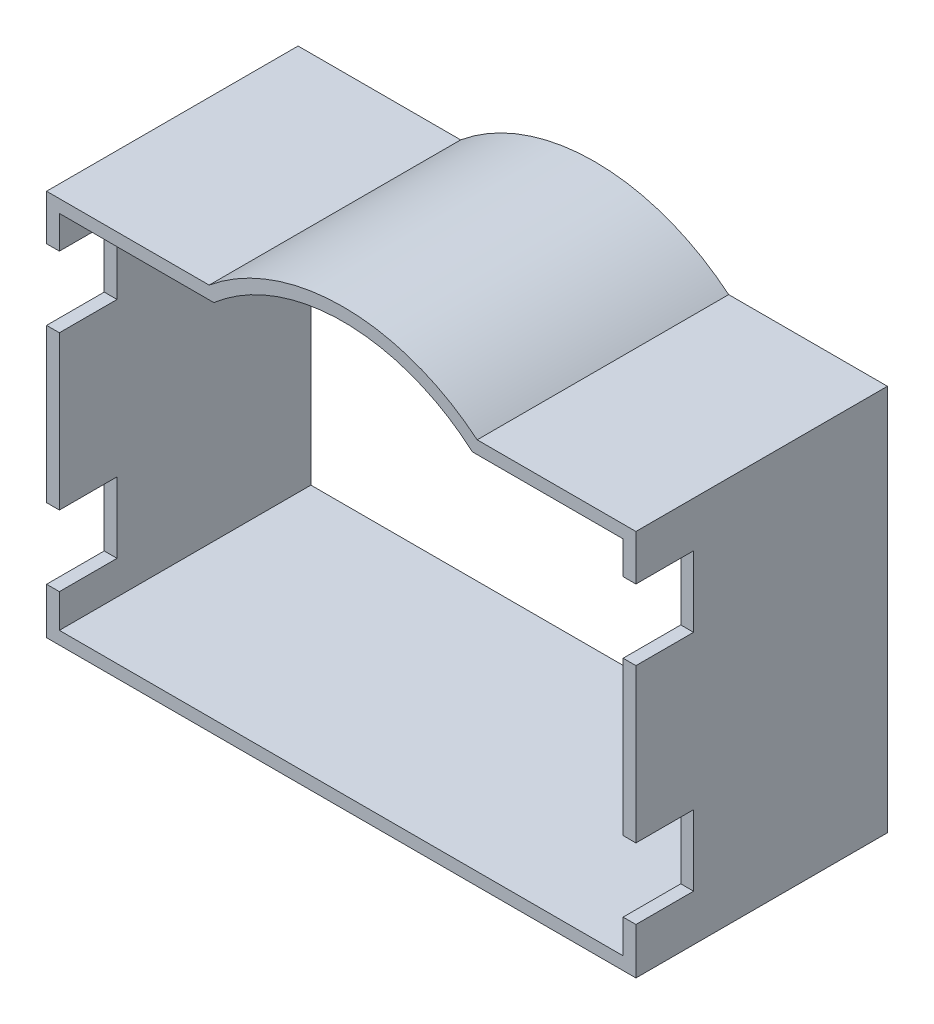
ISO-10303-21;
HEADER;
FILE_DESCRIPTION(('STEP AP214'),'2;1');
FILE_NAME('part.step','',(''),(''),'','','');
FILE_SCHEMA(('AUTOMOTIVE_DESIGN { 1 0 10303 214 1 1 1 1 }'));
ENDSEC;
DATA;
#1=APPLICATION_CONTEXT('core data for automotive mechanical design processes');
#2=APPLICATION_PROTOCOL_DEFINITION('international standard','automotive_design',2000,#1);
#3=PRODUCT_CONTEXT('',#1,'mechanical');
#4=PRODUCT('Part','Part','',(#3));
#5=PRODUCT_RELATED_PRODUCT_CATEGORY('part','',(#4));
#6=PRODUCT_DEFINITION_FORMATION('','',#4);
#7=PRODUCT_DEFINITION_CONTEXT('part definition',#1,'design');
#8=PRODUCT_DEFINITION('design','',#6,#7);
#9=PRODUCT_DEFINITION_SHAPE('','',#8);
#10=(LENGTH_UNIT() NAMED_UNIT(*) SI_UNIT(.MILLI.,.METRE.));
#11=(NAMED_UNIT(*) PLANE_ANGLE_UNIT() SI_UNIT($,.RADIAN.));
#12=(NAMED_UNIT(*) SI_UNIT($,.STERADIAN.) SOLID_ANGLE_UNIT());
#13=UNCERTAINTY_MEASURE_WITH_UNIT(LENGTH_MEASURE(1.E-05),#10,'distance_accuracy_value','');
#14=(GEOMETRIC_REPRESENTATION_CONTEXT(3) GLOBAL_UNCERTAINTY_ASSIGNED_CONTEXT((#13)) GLOBAL_UNIT_ASSIGNED_CONTEXT((#10,
#11,#12)) REPRESENTATION_CONTEXT('',''));
#15=CARTESIAN_POINT('',(0.,0.,0.));
#16=DIRECTION('',(0.,0.,1.));
#17=DIRECTION('',(1.,0.,0.));
#18=AXIS2_PLACEMENT_3D('',#15,#16,#17);
#19=CARTESIAN_POINT('',(-5.12505883331051,40.0050902585687,49.8602));
#20=DIRECTION('',(0.,0.,-1.));
#21=DIRECTION('',(-1.,0.,0.));
#22=AXIS2_PLACEMENT_3D('',#19,#20,#21);
#23=PLANE('',#22);
#24=DIRECTION('',(0.,-1.,0.));
#25=VECTOR('',#24,1.);
#26=CARTESIAN_POINT('',(-63.9235600904745,40.0050902585687,49.8602));
#27=LINE('',#26,#25);
#28=CARTESIAN_POINT('',(-63.9235600904745,49.1149246648017,49.8602));
#29=VERTEX_POINT('',#28);
#30=CARTESIAN_POINT('',(-63.9235600904744,18.6689837729242,49.8602));
#31=VERTEX_POINT('',#30);
#32=EDGE_CURVE('E482',#29,#31,#27,.T.);
#33=ORIENTED_EDGE('',*,*,#32,.T.);
#34=DIRECTION('',(-1.,0.,0.));
#35=VECTOR('',#34,1.);
#36=CARTESIAN_POINT('',(-63.9235600904744,18.6689837729242,49.8602));
#37=LINE('',#36,#35);
#38=CARTESIAN_POINT('',(-61.3835600904745,18.6689837729242,49.8602));
#39=VERTEX_POINT('',#38);
#40=EDGE_CURVE('E268',#39,#31,#37,.T.);
#41=ORIENTED_EDGE('',*,*,#40,.F.);
#42=DIRECTION('',(0.,-1.,0.));
#43=VECTOR('',#42,1.);
#44=CARTESIAN_POINT('',(-61.3835600904745,-1.97724052467224,49.8602));
#45=LINE('',#44,#43);
#46=CARTESIAN_POINT('',(-61.3835600904745,49.1149246648017,49.8602));
#47=VERTEX_POINT('',#46);
#48=EDGE_CURVE('E377',#47,#39,#45,.T.);
#49=ORIENTED_EDGE('',*,*,#48,.F.);
#50=DIRECTION('',(1.,0.,0.));
#51=VECTOR('',#50,1.);
#52=CARTESIAN_POINT('',(-63.9235600904745,49.1149246648017,49.8602));
#53=LINE('',#52,#51);
#54=EDGE_CURVE('E289',#29,#47,#53,.T.);
#55=ORIENTED_EDGE('',*,*,#54,.F.);
#56=EDGE_LOOP('',(#33,#41,#49,#55));
#57=FACE_BOUND('',#56,.T.);
#58=ADVANCED_FACE('F39',(#57),#23,.F.);
#59=DIRECTION('',(0.,1.,0.));
#60=VECTOR('',#59,1.);
#61=CARTESIAN_POINT('',(52.9114432215255,40.0050902585687,49.8602));
#62=LINE('',#61,#60);
#63=CARTESIAN_POINT('',(52.9114432215256,18.6689837729242,49.8602));
#64=VERTEX_POINT('',#63);
#65=CARTESIAN_POINT('',(52.9114432215256,49.1149246648017,49.8602));
#66=VERTEX_POINT('',#65);
#67=EDGE_CURVE('E255',#64,#66,#62,.T.);
#68=ORIENTED_EDGE('',*,*,#67,.T.);
#69=DIRECTION('',(1.,0.,0.));
#70=VECTOR('',#69,1.);
#71=CARTESIAN_POINT('',(52.9114432215256,49.1149246648017,49.8602));
#72=LINE('',#71,#70);
#73=CARTESIAN_POINT('',(50.3714432215255,49.1149246648017,49.8602));
#74=VERTEX_POINT('',#73);
#75=EDGE_CURVE('E304',#74,#66,#72,.T.);
#76=ORIENTED_EDGE('',*,*,#75,.F.);
#77=DIRECTION('',(0.,1.,0.));
#78=VECTOR('',#77,1.);
#79=CARTESIAN_POINT('',(50.3714432215255,-1.97724052467224,49.8602));
#80=LINE('',#79,#78);
#81=CARTESIAN_POINT('',(50.3714432215255,18.6689837729242,49.8602));
#82=VERTEX_POINT('',#81);
#83=EDGE_CURVE('E386',#82,#74,#80,.T.);
#84=ORIENTED_EDGE('',*,*,#83,.F.);
#85=DIRECTION('',(-1.,0.,0.));
#86=VECTOR('',#85,1.);
#87=CARTESIAN_POINT('',(52.9114432215256,18.6689837729242,49.8602));
#88=LINE('',#87,#86);
#89=EDGE_CURVE('E564',#64,#82,#88,.T.);
#90=ORIENTED_EDGE('',*,*,#89,.F.);
#91=EDGE_LOOP('',(#68,#76,#84,#90));
#92=FACE_BOUND('',#91,.T.);
#93=ADVANCED_FACE('F563',(#92),#23,.F.);
#94=CARTESIAN_POINT('',(-61.3835600904745,4.66896129128226,49.8602));
#95=VERTEX_POINT('',#94);
#96=CARTESIAN_POINT('',(-61.3835600904745,-1.97724052467224,49.8602));
#97=VERTEX_POINT('',#96);
#98=EDGE_CURVE('E371',#95,#97,#45,.T.);
#99=ORIENTED_EDGE('',*,*,#98,.F.);
#100=DIRECTION('',(1.,0.,0.));
#101=VECTOR('',#100,1.);
#102=CARTESIAN_POINT('',(-63.9235600904744,4.66896129128226,49.8602));
#103=LINE('',#102,#101);
#104=CARTESIAN_POINT('',(-63.9235600904744,4.66896129128226,49.8602));
#105=VERTEX_POINT('',#104);
#106=EDGE_CURVE('E279',#105,#95,#103,.T.);
#107=ORIENTED_EDGE('',*,*,#106,.F.);
#108=CARTESIAN_POINT('',(-63.9235600904745,-4.51724052467224,49.8602));
#109=VERTEX_POINT('',#108);
#110=EDGE_CURVE('E476',#105,#109,#27,.T.);
#111=ORIENTED_EDGE('',*,*,#110,.T.);
#112=DIRECTION('',(1.,0.,0.));
#113=VECTOR('',#112,1.);
#114=CARTESIAN_POINT('',(-5.12505883331051,-4.51724052467224,49.8602));
#115=LINE('',#114,#113);
#116=CARTESIAN_POINT('',(52.9114432215255,-4.51724052467224,49.8602));
#117=VERTEX_POINT('',#116);
#118=EDGE_CURVE('E481',#109,#117,#115,.T.);
#119=ORIENTED_EDGE('',*,*,#118,.T.);
#120=CARTESIAN_POINT('',(52.9114432215256,4.66896129128226,49.8602));
#121=VERTEX_POINT('',#120);
#122=EDGE_CURVE('E485',#117,#121,#62,.T.);
#123=ORIENTED_EDGE('',*,*,#122,.T.);
#124=DIRECTION('',(1.,0.,0.));
#125=VECTOR('',#124,1.);
#126=CARTESIAN_POINT('',(52.9114432215256,4.66896129128226,49.8602));
#127=LINE('',#126,#125);
#128=CARTESIAN_POINT('',(50.3714432215255,4.66896129128226,49.8602));
#129=VERTEX_POINT('',#128);
#130=EDGE_CURVE('E248',#129,#121,#127,.T.);
#131=ORIENTED_EDGE('',*,*,#130,.F.);
#132=CARTESIAN_POINT('',(50.3714432215255,-1.97724052467224,49.8602));
#133=VERTEX_POINT('',#132);
#134=EDGE_CURVE('E381',#133,#129,#80,.T.);
#135=ORIENTED_EDGE('',*,*,#134,.F.);
#136=DIRECTION('',(1.,0.,0.));
#137=VECTOR('',#136,1.);
#138=CARTESIAN_POINT('',(-61.3835600904745,-1.97724052467224,49.8602));
#139=LINE('',#138,#137);
#140=EDGE_CURVE('E376',#97,#133,#139,.T.);
#141=ORIENTED_EDGE('',*,*,#140,.F.);
#142=EDGE_LOOP('',(#99,#107,#111,#119,#123,#131,#135,#141));
#143=FACE_BOUND('',#142,.T.);
#144=ADVANCED_FACE('F588',(#143),#23,.F.);
#145=CARTESIAN_POINT('',(50.3714432215255,63.1189826998972,49.8602));
#146=VERTEX_POINT('',#145);
#147=CARTESIAN_POINT('',(50.3714432215255,69.6059637898241,49.8602));
#148=VERTEX_POINT('',#147);
#149=EDGE_CURVE('E380',#146,#148,#80,.T.);
#150=ORIENTED_EDGE('',*,*,#149,.F.);
#151=DIRECTION('',(-1.,0.,0.));
#152=VECTOR('',#151,1.);
#153=CARTESIAN_POINT('',(52.9114432215256,63.1189826998972,49.8602));
#154=LINE('',#153,#152);
#155=CARTESIAN_POINT('',(52.9114432215256,63.1189826998972,49.8602));
#156=VERTEX_POINT('',#155);
#157=EDGE_CURVE('E315',#156,#146,#154,.T.);
#158=ORIENTED_EDGE('',*,*,#157,.F.);
#159=CARTESIAN_POINT('',(52.9114432215255,72.1459637898241,49.8602));
#160=VERTEX_POINT('',#159);
#161=EDGE_CURVE('E484',#156,#160,#62,.T.);
#162=ORIENTED_EDGE('',*,*,#161,.T.);
#163=DIRECTION('',(-1.,0.,0.));
#164=VECTOR('',#163,1.);
#165=CARTESIAN_POINT('',(-5.12505883331051,72.1459637898241,49.8602));
#166=LINE('',#165,#164);
#167=CARTESIAN_POINT('',(21.4410870415425,72.1459637898241,49.8602));
#168=VERTEX_POINT('',#167);
#169=EDGE_CURVE('E43',#160,#168,#166,.T.);
#170=ORIENTED_EDGE('',*,*,#169,.T.);
#171=CARTESIAN_POINT('',(-5.12505883331051,40.0050902585687,49.8602));
#172=DIRECTION('',(0.,0.,-1.));
#173=DIRECTION('',(-1.,0.,0.));
#174=AXIS2_PLACEMENT_3D('',#171,#172,#173);
#175=CIRCLE('',#174,41.6988711837157);
#176=CARTESIAN_POINT('',(-31.6912047081635,72.1459637898241,49.8602));
#177=VERTEX_POINT('',#176);
#178=EDGE_CURVE('E458',#168,#177,#175,.F.);
#179=ORIENTED_EDGE('',*,*,#178,.T.);
#180=DIRECTION('',(-1.,0.,0.));
#181=VECTOR('',#180,1.);
#182=CARTESIAN_POINT('',(-5.12505883331051,72.1459637898241,49.8602));
#183=LINE('',#182,#181);
#184=CARTESIAN_POINT('',(-63.9235600904745,72.1459637898241,49.8602));
#185=VERTEX_POINT('',#184);
#186=EDGE_CURVE('E473',#177,#185,#183,.T.);
#187=ORIENTED_EDGE('',*,*,#186,.T.);
#188=CARTESIAN_POINT('',(-63.9235600904745,63.1189622718156,49.8602));
#189=VERTEX_POINT('',#188);
#190=EDGE_CURVE('E477',#185,#189,#27,.T.);
#191=ORIENTED_EDGE('',*,*,#190,.T.);
#192=DIRECTION('',(-1.,0.,0.));
#193=VECTOR('',#192,1.);
#194=CARTESIAN_POINT('',(-63.9235600904745,63.1189622718156,49.8602));
#195=LINE('',#194,#193);
#196=CARTESIAN_POINT('',(-61.3835600904745,63.1189622718156,49.8602));
#197=VERTEX_POINT('',#196);
#198=EDGE_CURVE('E335',#197,#189,#195,.T.);
#199=ORIENTED_EDGE('',*,*,#198,.F.);
#200=CARTESIAN_POINT('',(-61.3835600904745,69.6059637898241,49.8602));
#201=VERTEX_POINT('',#200);
#202=EDGE_CURVE('E372',#201,#197,#45,.T.);
#203=ORIENTED_EDGE('',*,*,#202,.F.);
#204=DIRECTION('',(-1.,0.,0.));
#205=VECTOR('',#204,1.);
#206=CARTESIAN_POINT('',(-61.3835600904745,69.6059637898241,49.8602));
#207=LINE('',#206,#205);
#208=CARTESIAN_POINT('',(-30.761077997164,69.6059637898241,49.8602));
#209=VERTEX_POINT('',#208);
#210=EDGE_CURVE('E367',#209,#201,#207,.T.);
#211=ORIENTED_EDGE('',*,*,#210,.F.);
#212=CARTESIAN_POINT('',(-5.12505883331051,40.0050902585687,49.8602));
#213=DIRECTION('',(0.,0.,1.));
#214=DIRECTION('',(-1.,0.,0.));
#215=AXIS2_PLACEMENT_3D('',#212,#213,#214);
#216=CIRCLE('',#215,39.1588711837157);
#217=CARTESIAN_POINT('',(20.510960330543,69.6059637898241,49.8602));
#218=VERTEX_POINT('',#217);
#219=EDGE_CURVE('E364',#218,#209,#216,.T.);
#220=ORIENTED_EDGE('',*,*,#219,.F.);
#221=DIRECTION('',(-1.,0.,0.));
#222=VECTOR('',#221,1.);
#223=CARTESIAN_POINT('',(20.510960330543,69.6059637898241,49.8602));
#224=LINE('',#223,#222);
#225=EDGE_CURVE('E385',#148,#218,#224,.T.);
#226=ORIENTED_EDGE('',*,*,#225,.F.);
#227=EDGE_LOOP('',(#150,#158,#162,#170,#179,#187,#191,#199,#203,#211,#220,#226));
#228=FACE_BOUND('',#227,.T.);
#229=ADVANCED_FACE('F499',(#228),#23,.F.);
#230=CARTESIAN_POINT('',(-5.12505883331051,40.0050902585687,0.));
#231=DIRECTION('',(0.,0.,-1.));
#232=DIRECTION('',(-1.,0.,0.));
#233=AXIS2_PLACEMENT_3D('',#230,#231,#232);
#234=PLANE('',#233);
#235=CARTESIAN_POINT('',(-5.12505883331051,40.0050902585687,0.));
#236=DIRECTION('',(0.,0.,-1.));
#237=DIRECTION('',(-1.,0.,0.));
#238=AXIS2_PLACEMENT_3D('',#235,#236,#237);
#239=CIRCLE('',#238,41.6988711837157);
#240=CARTESIAN_POINT('',(21.4410870415425,72.1459637898241,0.));
#241=VERTEX_POINT('',#240);
#242=CARTESIAN_POINT('',(-31.6912047081635,72.1459637898241,0.));
#243=VERTEX_POINT('',#242);
#244=EDGE_CURVE('E430',#241,#243,#239,.F.);
#245=ORIENTED_EDGE('',*,*,#244,.F.);
#246=DIRECTION('',(-1.,0.,0.));
#247=VECTOR('',#246,1.);
#248=CARTESIAN_POINT('',(-5.12505883331051,72.1459637898241,0.));
#249=LINE('',#248,#247);
#250=CARTESIAN_POINT('',(52.9114432215255,72.1459637898241,0.));
#251=VERTEX_POINT('',#250);
#252=EDGE_CURVE('E455',#251,#241,#249,.T.);
#253=ORIENTED_EDGE('',*,*,#252,.F.);
#254=DIRECTION('',(0.,1.,0.));
#255=VECTOR('',#254,1.);
#256=CARTESIAN_POINT('',(52.9114432215255,40.0050902585687,0.));
#257=LINE('',#256,#255);
#258=CARTESIAN_POINT('',(52.9114432215255,-4.51724052467224,0.));
#259=VERTEX_POINT('',#258);
#260=EDGE_CURVE('E459',#259,#251,#257,.T.);
#261=ORIENTED_EDGE('',*,*,#260,.F.);
#262=DIRECTION('',(1.,0.,0.));
#263=VECTOR('',#262,1.);
#264=CARTESIAN_POINT('',(-5.12505883331051,-4.51724052467224,0.));
#265=LINE('',#264,#263);
#266=CARTESIAN_POINT('',(-63.9235600904745,-4.51724052467224,0.));
#267=VERTEX_POINT('',#266);
#268=EDGE_CURVE('E462',#267,#259,#265,.T.);
#269=ORIENTED_EDGE('',*,*,#268,.F.);
#270=DIRECTION('',(0.,-1.,0.));
#271=VECTOR('',#270,1.);
#272=CARTESIAN_POINT('',(-63.9235600904745,40.0050902585687,0.));
#273=LINE('',#272,#271);
#274=CARTESIAN_POINT('',(-63.9235600904745,72.1459637898241,0.));
#275=VERTEX_POINT('',#274);
#276=EDGE_CURVE('E465',#275,#267,#273,.T.);
#277=ORIENTED_EDGE('',*,*,#276,.F.);
#278=DIRECTION('',(-1.,0.,0.));
#279=VECTOR('',#278,1.);
#280=CARTESIAN_POINT('',(-5.12505883331051,72.1459637898241,0.));
#281=LINE('',#280,#279);
#282=EDGE_CURVE('E454',#243,#275,#281,.T.);
#283=ORIENTED_EDGE('',*,*,#282,.F.);
#284=EDGE_LOOP('',(#245,#253,#261,#269,#277,#283));
#285=FACE_BOUND('',#284,.T.);
#286=DIRECTION('',(-1.,0.,0.));
#287=VECTOR('',#286,1.);
#288=CARTESIAN_POINT('',(20.510960330543,69.6059637898241,0.));
#289=LINE('',#288,#287);
#290=CARTESIAN_POINT('',(50.3714432215255,69.6059637898241,0.));
#291=VERTEX_POINT('',#290);
#292=CARTESIAN_POINT('',(20.510960330543,69.6059637898241,0.));
#293=VERTEX_POINT('',#292);
#294=EDGE_CURVE('E368',#291,#293,#289,.T.);
#295=ORIENTED_EDGE('',*,*,#294,.T.);
#296=CARTESIAN_POINT('',(-5.12505883331051,40.0050902585687,0.));
#297=DIRECTION('',(0.,0.,1.));
#298=DIRECTION('',(-1.,0.,0.));
#299=AXIS2_PLACEMENT_3D('',#296,#297,#298);
#300=CIRCLE('',#299,39.1588711837157);
#301=CARTESIAN_POINT('',(-30.761077997164,69.6059637898241,0.));
#302=VERTEX_POINT('',#301);
#303=EDGE_CURVE('E354',#293,#302,#300,.T.);
#304=ORIENTED_EDGE('',*,*,#303,.T.);
#305=DIRECTION('',(-1.,0.,0.));
#306=VECTOR('',#305,1.);
#307=CARTESIAN_POINT('',(-61.3835600904745,69.6059637898241,0.));
#308=LINE('',#307,#306);
#309=CARTESIAN_POINT('',(-61.3835600904745,69.6059637898241,0.));
#310=VERTEX_POINT('',#309);
#311=EDGE_CURVE('E393',#302,#310,#308,.T.);
#312=ORIENTED_EDGE('',*,*,#311,.T.);
#313=DIRECTION('',(0.,-1.,0.));
#314=VECTOR('',#313,1.);
#315=CARTESIAN_POINT('',(-61.3835600904745,-1.97724052467224,0.));
#316=LINE('',#315,#314);
#317=CARTESIAN_POINT('',(-61.3835600904745,-1.97724052467224,0.));
#318=VERTEX_POINT('',#317);
#319=EDGE_CURVE('E397',#310,#318,#316,.T.);
#320=ORIENTED_EDGE('',*,*,#319,.T.);
#321=DIRECTION('',(1.,0.,0.));
#322=VECTOR('',#321,1.);
#323=CARTESIAN_POINT('',(-61.3835600904745,-1.97724052467224,0.));
#324=LINE('',#323,#322);
#325=CARTESIAN_POINT('',(50.3714432215255,-1.97724052467224,0.));
#326=VERTEX_POINT('',#325);
#327=EDGE_CURVE('E401',#318,#326,#324,.T.);
#328=ORIENTED_EDGE('',*,*,#327,.T.);
#329=DIRECTION('',(0.,1.,0.));
#330=VECTOR('',#329,1.);
#331=CARTESIAN_POINT('',(50.3714432215255,-1.97724052467224,0.));
#332=LINE('',#331,#330);
#333=EDGE_CURVE('E405',#326,#291,#332,.T.);
#334=ORIENTED_EDGE('',*,*,#333,.T.);
#335=EDGE_LOOP('',(#295,#304,#312,#320,#328,#334));
#336=FACE_BOUND('',#335,.T.);
#337=ADVANCED_FACE('F544',(#285,#336),#234,.T.);
#338=CARTESIAN_POINT('',(-5.12505883331051,40.0050902585687,49.8602));
#339=DIRECTION('',(0.,0.,-1.));
#340=DIRECTION('',(-1.,0.,0.));
#341=AXIS2_PLACEMENT_3D('',#338,#339,#340);
#342=CYLINDRICAL_SURFACE('',#341,41.6988711837157);
#343=ORIENTED_EDGE('',*,*,#244,.T.);
#344=DIRECTION('',(0.,0.,-1.));
#345=VECTOR('',#344,1.);
#346=CARTESIAN_POINT('',(-31.6912047081635,72.1459637898241,49.8602));
#347=LINE('',#346,#345);
#348=EDGE_CURVE('E11',#177,#243,#347,.T.);
#349=ORIENTED_EDGE('',*,*,#348,.F.);
#350=ORIENTED_EDGE('',*,*,#178,.F.);
#351=DIRECTION('',(0.,0.,-1.));
#352=VECTOR('',#351,1.);
#353=CARTESIAN_POINT('',(21.4410870415425,72.1459637898241,49.8602));
#354=LINE('',#353,#352);
#355=EDGE_CURVE('E432',#168,#241,#354,.T.);
#356=ORIENTED_EDGE('',*,*,#355,.T.);
#357=EDGE_LOOP('',(#343,#349,#350,#356));
#358=FACE_BOUND('',#357,.T.);
#359=ADVANCED_FACE('F510',(#358),#342,.T.);
#360=CARTESIAN_POINT('',(-61.3835600904745,72.1459637898241,49.8602));
#361=DIRECTION('',(0.,-1.,0.));
#362=DIRECTION('',(0.,0.,-1.));
#363=AXIS2_PLACEMENT_3D('',#360,#361,#362);
#364=PLANE('',#363);
#365=ORIENTED_EDGE('',*,*,#282,.T.);
#366=DIRECTION('',(0.,0.,-1.));
#367=VECTOR('',#366,1.);
#368=CARTESIAN_POINT('',(-63.9235600904745,72.1459637898241,49.8602));
#369=LINE('',#368,#367);
#370=EDGE_CURVE('E49',#185,#275,#369,.T.);
#371=ORIENTED_EDGE('',*,*,#370,.F.);
#372=ORIENTED_EDGE('',*,*,#186,.F.);
#373=ORIENTED_EDGE('',*,*,#348,.T.);
#374=EDGE_LOOP('',(#365,#371,#372,#373));
#375=FACE_BOUND('',#374,.T.);
#376=ADVANCED_FACE('F515',(#375),#364,.F.);
#377=CARTESIAN_POINT('',(-63.9235600904745,-1.97724052467224,49.8602));
#378=DIRECTION('',(1.,0.,0.));
#379=DIRECTION('',(0.,0.,-1.));
#380=AXIS2_PLACEMENT_3D('',#377,#378,#379);
#381=PLANE('',#380);
#382=DIRECTION('',(0.,-1.,0.));
#383=VECTOR('',#382,1.);
#384=CARTESIAN_POINT('',(-63.9235600904744,18.6689837729242,38.4302));
#385=LINE('',#384,#383);
#386=CARTESIAN_POINT('',(-63.9235600904744,18.6689837729242,38.4302));
#387=VERTEX_POINT('',#386);
#388=CARTESIAN_POINT('',(-63.9235600904744,4.66896129128226,38.4302));
#389=VERTEX_POINT('',#388);
#390=EDGE_CURVE('E265',#387,#389,#385,.T.);
#391=ORIENTED_EDGE('',*,*,#390,.F.);
#392=DIRECTION('',(0.,0.,1.));
#393=VECTOR('',#392,1.);
#394=CARTESIAN_POINT('',(-63.9235600904744,18.6689837729242,38.4302));
#395=LINE('',#394,#393);
#396=EDGE_CURVE('E285',#387,#31,#395,.T.);
#397=ORIENTED_EDGE('',*,*,#396,.T.);
#398=ORIENTED_EDGE('',*,*,#32,.F.);
#399=DIRECTION('',(0.,0.,1.));
#400=VECTOR('',#399,1.);
#401=CARTESIAN_POINT('',(-63.9235600904745,49.1149246648017,38.4302));
#402=LINE('',#401,#400);
#403=CARTESIAN_POINT('',(-63.9235600904745,49.1149246648017,38.4302));
#404=VERTEX_POINT('',#403);
#405=EDGE_CURVE('E345',#404,#29,#402,.T.);
#406=ORIENTED_EDGE('',*,*,#405,.F.);
#407=DIRECTION('',(0.,-1.,0.));
#408=VECTOR('',#407,1.);
#409=CARTESIAN_POINT('',(-63.9235600904745,63.1189622718156,38.4302));
#410=LINE('',#409,#408);
#411=CARTESIAN_POINT('',(-63.9235600904745,63.1189622718156,38.4302));
#412=VERTEX_POINT('',#411);
#413=EDGE_CURVE('E332',#412,#404,#410,.T.);
#414=ORIENTED_EDGE('',*,*,#413,.F.);
#415=DIRECTION('',(0.,0.,1.));
#416=VECTOR('',#415,1.);
#417=CARTESIAN_POINT('',(-63.9235600904745,63.1189622718156,38.4302));
#418=LINE('',#417,#416);
#419=EDGE_CURVE('E350',#412,#189,#418,.T.);
#420=ORIENTED_EDGE('',*,*,#419,.T.);
#421=ORIENTED_EDGE('',*,*,#190,.F.);
#422=ORIENTED_EDGE('',*,*,#370,.T.);
#423=ORIENTED_EDGE('',*,*,#276,.T.);
#424=DIRECTION('',(0.,0.,-1.));
#425=VECTOR('',#424,1.);
#426=CARTESIAN_POINT('',(-63.9235600904745,-4.51724052467224,49.8602));
#427=LINE('',#426,#425);
#428=EDGE_CURVE('E440',#109,#267,#427,.T.);
#429=ORIENTED_EDGE('',*,*,#428,.F.);
#430=ORIENTED_EDGE('',*,*,#110,.F.);
#431=DIRECTION('',(0.,0.,1.));
#432=VECTOR('',#431,1.);
#433=CARTESIAN_POINT('',(-63.9235600904744,4.66896129128226,38.4302));
#434=LINE('',#433,#432);
#435=EDGE_CURVE('E278',#389,#105,#434,.T.);
#436=ORIENTED_EDGE('',*,*,#435,.F.);
#437=EDGE_LOOP('',(#391,#397,#398,#406,#414,#420,#421,#422,#423,#429,#430,#436));
#438=FACE_BOUND('',#437,.T.);
#439=ADVANCED_FACE('F519',(#438),#381,.F.);
#440=CARTESIAN_POINT('',(-61.3835600904745,-4.51724052467224,49.8602));
#441=DIRECTION('',(0.,1.,0.));
#442=DIRECTION('',(0.,0.,1.));
#443=AXIS2_PLACEMENT_3D('',#440,#441,#442);
#444=PLANE('',#443);
#445=ORIENTED_EDGE('',*,*,#268,.T.);
#446=DIRECTION('',(0.,0.,-1.));
#447=VECTOR('',#446,1.);
#448=CARTESIAN_POINT('',(52.9114432215255,-4.51724052467224,49.8602));
#449=LINE('',#448,#447);
#450=EDGE_CURVE('E444',#117,#259,#449,.T.);
#451=ORIENTED_EDGE('',*,*,#450,.F.);
#452=ORIENTED_EDGE('',*,*,#118,.F.);
#453=ORIENTED_EDGE('',*,*,#428,.T.);
#454=EDGE_LOOP('',(#445,#451,#452,#453));
#455=FACE_BOUND('',#454,.T.);
#456=ADVANCED_FACE('F716',(#455),#444,.F.);
#457=CARTESIAN_POINT('',(52.9114432215255,-1.97724052467224,49.8602));
#458=DIRECTION('',(-1.,0.,0.));
#459=DIRECTION('',(0.,0.,1.));
#460=AXIS2_PLACEMENT_3D('',#457,#458,#459);
#461=PLANE('',#460);
#462=DIRECTION('',(0.,1.,0.));
#463=VECTOR('',#462,1.);
#464=CARTESIAN_POINT('',(52.9114432215256,63.1189826998972,38.4302));
#465=LINE('',#464,#463);
#466=CARTESIAN_POINT('',(52.9114432215256,49.1149246648017,38.4302));
#467=VERTEX_POINT('',#466);
#468=CARTESIAN_POINT('',(52.9114432215256,63.1189826998972,38.4302));
#469=VERTEX_POINT('',#468);
#470=EDGE_CURVE('E299',#467,#469,#465,.T.);
#471=ORIENTED_EDGE('',*,*,#470,.F.);
#472=DIRECTION('',(0.,0.,1.));
#473=VECTOR('',#472,1.);
#474=CARTESIAN_POINT('',(52.9114432215256,49.1149246648017,38.4302));
#475=LINE('',#474,#473);
#476=EDGE_CURVE('E282',#467,#66,#475,.T.);
#477=ORIENTED_EDGE('',*,*,#476,.T.);
#478=ORIENTED_EDGE('',*,*,#67,.F.);
#479=DIRECTION('',(0.,0.,1.));
#480=VECTOR('',#479,1.);
#481=CARTESIAN_POINT('',(52.9114432215256,18.6689837729242,38.4302));
#482=LINE('',#481,#480);
#483=CARTESIAN_POINT('',(52.9114432215256,18.6689837729242,38.4302));
#484=VERTEX_POINT('',#483);
#485=EDGE_CURVE('E230',#484,#64,#482,.T.);
#486=ORIENTED_EDGE('',*,*,#485,.F.);
#487=DIRECTION('',(0.,1.,0.));
#488=VECTOR('',#487,1.);
#489=CARTESIAN_POINT('',(52.9114432215256,18.6689837729242,38.4302));
#490=LINE('',#489,#488);
#491=CARTESIAN_POINT('',(52.9114432215256,4.66896129128226,38.4302));
#492=VERTEX_POINT('',#491);
#493=EDGE_CURVE('E238',#492,#484,#490,.T.);
#494=ORIENTED_EDGE('',*,*,#493,.F.);
#495=DIRECTION('',(0.,0.,1.));
#496=VECTOR('',#495,1.);
#497=CARTESIAN_POINT('',(52.9114432215256,4.66896129128226,38.4302));
#498=LINE('',#497,#496);
#499=EDGE_CURVE('E318',#492,#121,#498,.T.);
#500=ORIENTED_EDGE('',*,*,#499,.T.);
#501=ORIENTED_EDGE('',*,*,#122,.F.);
#502=ORIENTED_EDGE('',*,*,#450,.T.);
#503=ORIENTED_EDGE('',*,*,#260,.T.);
#504=DIRECTION('',(0.,0.,-1.));
#505=VECTOR('',#504,1.);
#506=CARTESIAN_POINT('',(52.9114432215255,72.1459637898241,49.8602));
#507=LINE('',#506,#505);
#508=EDGE_CURVE('E436',#160,#251,#507,.T.);
#509=ORIENTED_EDGE('',*,*,#508,.F.);
#510=ORIENTED_EDGE('',*,*,#161,.F.);
#511=DIRECTION('',(0.,0.,1.));
#512=VECTOR('',#511,1.);
#513=CARTESIAN_POINT('',(52.9114432215256,63.1189826998972,38.4302));
#514=LINE('',#513,#512);
#515=EDGE_CURVE('E314',#469,#156,#514,.T.);
#516=ORIENTED_EDGE('',*,*,#515,.F.);
#517=EDGE_LOOP('',(#471,#477,#478,#486,#494,#500,#501,#502,#503,#509,#510,#516));
#518=FACE_BOUND('',#517,.T.);
#519=ADVANCED_FACE('F252',(#518),#461,.F.);
#520=CARTESIAN_POINT('',(20.510960330543,72.1459637898241,49.8602));
#521=DIRECTION('',(0.,-1.,0.));
#522=DIRECTION('',(0.,0.,-1.));
#523=AXIS2_PLACEMENT_3D('',#520,#521,#522);
#524=PLANE('',#523);
#525=ORIENTED_EDGE('',*,*,#252,.T.);
#526=ORIENTED_EDGE('',*,*,#355,.F.);
#527=ORIENTED_EDGE('',*,*,#169,.F.);
#528=ORIENTED_EDGE('',*,*,#508,.T.);
#529=EDGE_LOOP('',(#525,#526,#527,#528));
#530=FACE_BOUND('',#529,.T.);
#531=ADVANCED_FACE('F41',(#530),#524,.F.);
#532=CARTESIAN_POINT('',(-5.12505883331051,40.0050902585687,49.8602));
#533=DIRECTION('',(0.,0.,-1.));
#534=DIRECTION('',(-1.,0.,0.));
#535=AXIS2_PLACEMENT_3D('',#532,#533,#534);
#536=CYLINDRICAL_SURFACE('',#535,39.1588711837157);
#537=ORIENTED_EDGE('',*,*,#303,.F.);
#538=DIRECTION('',(0.,0.,-1.));
#539=VECTOR('',#538,1.);
#540=CARTESIAN_POINT('',(20.510960330543,69.6059637898241,49.8602));
#541=LINE('',#540,#539);
#542=EDGE_CURVE('E389',#218,#293,#541,.T.);
#543=ORIENTED_EDGE('',*,*,#542,.F.);
#544=ORIENTED_EDGE('',*,*,#219,.T.);
#545=DIRECTION('',(0.,0.,-1.));
#546=VECTOR('',#545,1.);
#547=CARTESIAN_POINT('',(-30.761077997164,69.6059637898241,49.8602));
#548=LINE('',#547,#546);
#549=EDGE_CURVE('E427',#209,#302,#548,.T.);
#550=ORIENTED_EDGE('',*,*,#549,.T.);
#551=EDGE_LOOP('',(#537,#543,#544,#550));
#552=FACE_BOUND('',#551,.T.);
#553=ADVANCED_FACE('F547',(#552),#536,.F.);
#554=CARTESIAN_POINT('',(-61.3835600904745,69.6059637898241,49.8602));
#555=DIRECTION('',(0.,-1.,0.));
#556=DIRECTION('',(0.,0.,-1.));
#557=AXIS2_PLACEMENT_3D('',#554,#555,#556);
#558=PLANE('',#557);
#559=ORIENTED_EDGE('',*,*,#311,.F.);
#560=ORIENTED_EDGE('',*,*,#549,.F.);
#561=ORIENTED_EDGE('',*,*,#210,.T.);
#562=DIRECTION('',(0.,0.,-1.));
#563=VECTOR('',#562,1.);
#564=CARTESIAN_POINT('',(-61.3835600904745,69.6059637898241,49.8602));
#565=LINE('',#564,#563);
#566=EDGE_CURVE('E423',#201,#310,#565,.T.);
#567=ORIENTED_EDGE('',*,*,#566,.T.);
#568=EDGE_LOOP('',(#559,#560,#561,#567));
#569=FACE_BOUND('',#568,.T.);
#570=ADVANCED_FACE('F540',(#569),#558,.T.);
#571=CARTESIAN_POINT('',(-61.3835600904745,-1.97724052467224,49.8602));
#572=DIRECTION('',(1.,0.,0.));
#573=DIRECTION('',(0.,0.,-1.));
#574=AXIS2_PLACEMENT_3D('',#571,#572,#573);
#575=PLANE('',#574);
#576=DIRECTION('',(0.,0.,1.));
#577=VECTOR('',#576,1.);
#578=CARTESIAN_POINT('',(-61.3835600904745,18.6689837729242,38.4302));
#579=LINE('',#578,#577);
#580=CARTESIAN_POINT('',(-61.3835600904745,18.6689837729242,38.4302));
#581=VERTEX_POINT('',#580);
#582=EDGE_CURVE('E290',#581,#39,#579,.T.);
#583=ORIENTED_EDGE('',*,*,#582,.F.);
#584=DIRECTION('',(0.,1.,0.));
#585=VECTOR('',#584,1.);
#586=CARTESIAN_POINT('',(-61.3835600904745,18.6689837729242,38.4302));
#587=LINE('',#586,#585);
#588=CARTESIAN_POINT('',(-61.3835600904745,4.66896129128226,38.4302));
#589=VERTEX_POINT('',#588);
#590=EDGE_CURVE('E271',#589,#581,#587,.T.);
#591=ORIENTED_EDGE('',*,*,#590,.F.);
#592=DIRECTION('',(0.,0.,1.));
#593=VECTOR('',#592,1.);
#594=CARTESIAN_POINT('',(-61.3835600904745,4.66896129128226,38.4302));
#595=LINE('',#594,#593);
#596=EDGE_CURVE('E293',#589,#95,#595,.T.);
#597=ORIENTED_EDGE('',*,*,#596,.T.);
#598=ORIENTED_EDGE('',*,*,#98,.T.);
#599=DIRECTION('',(0.,0.,-1.));
#600=VECTOR('',#599,1.);
#601=CARTESIAN_POINT('',(-61.3835600904745,-1.97724052467224,49.8602));
#602=LINE('',#601,#600);
#603=EDGE_CURVE('E420',#97,#318,#602,.T.);
#604=ORIENTED_EDGE('',*,*,#603,.T.);
#605=ORIENTED_EDGE('',*,*,#319,.F.);
#606=ORIENTED_EDGE('',*,*,#566,.F.);
#607=ORIENTED_EDGE('',*,*,#202,.T.);
#608=DIRECTION('',(0.,0.,1.));
#609=VECTOR('',#608,1.);
#610=CARTESIAN_POINT('',(-61.3835600904745,63.1189622718156,38.4302));
#611=LINE('',#610,#609);
#612=CARTESIAN_POINT('',(-61.3835600904745,63.1189622718156,38.4302));
#613=VERTEX_POINT('',#612);
#614=EDGE_CURVE('E355',#613,#197,#611,.T.);
#615=ORIENTED_EDGE('',*,*,#614,.F.);
#616=DIRECTION('',(0.,1.,0.));
#617=VECTOR('',#616,1.);
#618=CARTESIAN_POINT('',(-61.3835600904745,63.1189622718156,38.4302));
#619=LINE('',#618,#617);
#620=CARTESIAN_POINT('',(-61.3835600904745,49.1149246648017,38.4302));
#621=VERTEX_POINT('',#620);
#622=EDGE_CURVE('E338',#621,#613,#619,.T.);
#623=ORIENTED_EDGE('',*,*,#622,.F.);
#624=DIRECTION('',(0.,0.,1.));
#625=VECTOR('',#624,1.);
#626=CARTESIAN_POINT('',(-61.3835600904745,49.1149246648017,38.4302));
#627=LINE('',#626,#625);
#628=EDGE_CURVE('E358',#621,#47,#627,.T.);
#629=ORIENTED_EDGE('',*,*,#628,.T.);
#630=ORIENTED_EDGE('',*,*,#48,.T.);
#631=EDGE_LOOP('',(#583,#591,#597,#598,#604,#605,#606,#607,#615,#623,#629,#630));
#632=FACE_BOUND('',#631,.T.);
#633=ADVANCED_FACE('F530',(#632),#575,.T.);
#634=CARTESIAN_POINT('',(-61.3835600904745,-1.97724052467224,49.8602));
#635=DIRECTION('',(0.,1.,0.));
#636=DIRECTION('',(0.,0.,1.));
#637=AXIS2_PLACEMENT_3D('',#634,#635,#636);
#638=PLANE('',#637);
#639=ORIENTED_EDGE('',*,*,#327,.F.);
#640=ORIENTED_EDGE('',*,*,#603,.F.);
#641=ORIENTED_EDGE('',*,*,#140,.T.);
#642=DIRECTION('',(0.,0.,-1.));
#643=VECTOR('',#642,1.);
#644=CARTESIAN_POINT('',(50.3714432215255,-1.97724052467224,49.8602));
#645=LINE('',#644,#643);
#646=EDGE_CURVE('E417',#133,#326,#645,.T.);
#647=ORIENTED_EDGE('',*,*,#646,.T.);
#648=EDGE_LOOP('',(#639,#640,#641,#647));
#649=FACE_BOUND('',#648,.T.);
#650=ADVANCED_FACE('F702',(#649),#638,.T.);
#651=CARTESIAN_POINT('',(50.3714432215255,-1.97724052467224,49.8602));
#652=DIRECTION('',(-1.,0.,0.));
#653=DIRECTION('',(0.,0.,1.));
#654=AXIS2_PLACEMENT_3D('',#651,#652,#653);
#655=PLANE('',#654);
#656=DIRECTION('',(0.,0.,1.));
#657=VECTOR('',#656,1.);
#658=CARTESIAN_POINT('',(50.3714432215255,49.1149246648017,38.4302));
#659=LINE('',#658,#657);
#660=CARTESIAN_POINT('',(50.3714432215255,49.1149246648017,38.4302));
#661=VERTEX_POINT('',#660);
#662=EDGE_CURVE('E323',#661,#74,#659,.T.);
#663=ORIENTED_EDGE('',*,*,#662,.F.);
#664=DIRECTION('',(0.,-1.,0.));
#665=VECTOR('',#664,1.);
#666=CARTESIAN_POINT('',(50.3714432215255,63.1189826998972,38.4302));
#667=LINE('',#666,#665);
#668=CARTESIAN_POINT('',(50.3714432215255,63.1189826998972,38.4302));
#669=VERTEX_POINT('',#668);
#670=EDGE_CURVE('E307',#669,#661,#667,.T.);
#671=ORIENTED_EDGE('',*,*,#670,.F.);
#672=DIRECTION('',(0.,0.,1.));
#673=VECTOR('',#672,1.);
#674=CARTESIAN_POINT('',(50.3714432215255,63.1189826998972,38.4302));
#675=LINE('',#674,#673);
#676=EDGE_CURVE('E326',#669,#146,#675,.T.);
#677=ORIENTED_EDGE('',*,*,#676,.T.);
#678=ORIENTED_EDGE('',*,*,#149,.T.);
#679=DIRECTION('',(0.,0.,-1.));
#680=VECTOR('',#679,1.);
#681=CARTESIAN_POINT('',(50.3714432215255,69.6059637898241,49.8602));
#682=LINE('',#681,#680);
#683=EDGE_CURVE('E414',#148,#291,#682,.T.);
#684=ORIENTED_EDGE('',*,*,#683,.T.);
#685=ORIENTED_EDGE('',*,*,#333,.F.);
#686=ORIENTED_EDGE('',*,*,#646,.F.);
#687=ORIENTED_EDGE('',*,*,#134,.T.);
#688=DIRECTION('',(0.,0.,1.));
#689=VECTOR('',#688,1.);
#690=CARTESIAN_POINT('',(50.3714432215255,4.66896129128226,38.4302));
#691=LINE('',#690,#689);
#692=CARTESIAN_POINT('',(50.3714432215255,4.66896129128226,38.4302));
#693=VERTEX_POINT('',#692);
#694=EDGE_CURVE('E260',#693,#129,#691,.T.);
#695=ORIENTED_EDGE('',*,*,#694,.F.);
#696=DIRECTION('',(0.,-1.,0.));
#697=VECTOR('',#696,1.);
#698=CARTESIAN_POINT('',(50.3714432215255,18.6689837729242,38.4302));
#699=LINE('',#698,#697);
#700=CARTESIAN_POINT('',(50.3714432215255,18.6689837729242,38.4302));
#701=VERTEX_POINT('',#700);
#702=EDGE_CURVE('E237',#701,#693,#699,.T.);
#703=ORIENTED_EDGE('',*,*,#702,.F.);
#704=DIRECTION('',(0.,0.,1.));
#705=VECTOR('',#704,1.);
#706=CARTESIAN_POINT('',(50.3714432215255,18.6689837729242,38.4302));
#707=LINE('',#706,#705);
#708=EDGE_CURVE('E233',#701,#82,#707,.T.);
#709=ORIENTED_EDGE('',*,*,#708,.T.);
#710=ORIENTED_EDGE('',*,*,#83,.T.);
#711=EDGE_LOOP('',(#663,#671,#677,#678,#684,#685,#686,#687,#695,#703,#709,#710));
#712=FACE_BOUND('',#711,.T.);
#713=ADVANCED_FACE('F559',(#712),#655,.T.);
#714=CARTESIAN_POINT('',(20.510960330543,69.6059637898241,49.8602));
#715=DIRECTION('',(0.,-1.,0.));
#716=DIRECTION('',(0.,0.,-1.));
#717=AXIS2_PLACEMENT_3D('',#714,#715,#716);
#718=PLANE('',#717);
#719=ORIENTED_EDGE('',*,*,#294,.F.);
#720=ORIENTED_EDGE('',*,*,#683,.F.);
#721=ORIENTED_EDGE('',*,*,#225,.T.);
#722=ORIENTED_EDGE('',*,*,#542,.T.);
#723=EDGE_LOOP('',(#719,#720,#721,#722));
#724=FACE_BOUND('',#723,.T.);
#725=ADVANCED_FACE('F551',(#724),#718,.T.);
#726=CARTESIAN_POINT('',(52.9114432215256,4.66896129128226,38.4302));
#727=DIRECTION('',(0.,-1.,0.));
#728=DIRECTION('',(0.,0.,-1.));
#729=AXIS2_PLACEMENT_3D('',#726,#727,#728);
#730=PLANE('',#729);
#731=ORIENTED_EDGE('',*,*,#130,.T.);
#732=ORIENTED_EDGE('',*,*,#499,.F.);
#733=DIRECTION('',(1.,0.,0.));
#734=VECTOR('',#733,1.);
#735=CARTESIAN_POINT('',(52.9114432215256,4.66896129128226,38.4302));
#736=LINE('',#735,#734);
#737=EDGE_CURVE('E244',#693,#492,#736,.T.);
#738=ORIENTED_EDGE('',*,*,#737,.F.);
#739=ORIENTED_EDGE('',*,*,#694,.T.);
#740=EDGE_LOOP('',(#731,#732,#738,#739));
#741=FACE_BOUND('',#740,.T.);
#742=ADVANCED_FACE('F629',(#741),#730,.F.);
#743=CARTESIAN_POINT('',(52.9114432215256,18.6689837729242,38.4302));
#744=DIRECTION('',(0.,1.,0.));
#745=DIRECTION('',(0.,0.,1.));
#746=AXIS2_PLACEMENT_3D('',#743,#744,#745);
#747=PLANE('',#746);
#748=ORIENTED_EDGE('',*,*,#89,.T.);
#749=ORIENTED_EDGE('',*,*,#708,.F.);
#750=DIRECTION('',(-1.,0.,0.));
#751=VECTOR('',#750,1.);
#752=CARTESIAN_POINT('',(52.9114432215256,18.6689837729242,38.4302));
#753=LINE('',#752,#751);
#754=EDGE_CURVE('E226',#484,#701,#753,.T.);
#755=ORIENTED_EDGE('',*,*,#754,.F.);
#756=ORIENTED_EDGE('',*,*,#485,.T.);
#757=EDGE_LOOP('',(#748,#749,#755,#756));
#758=FACE_BOUND('',#757,.T.);
#759=ADVANCED_FACE('F228',(#758),#747,.F.);
#760=CARTESIAN_POINT('',(0.,0.,38.4302));
#761=DIRECTION('',(0.,0.,-1.));
#762=DIRECTION('',(-1.,0.,0.));
#763=AXIS2_PLACEMENT_3D('',#760,#761,#762);
#764=PLANE('',#763);
#765=ORIENTED_EDGE('',*,*,#493,.T.);
#766=ORIENTED_EDGE('',*,*,#754,.T.);
#767=ORIENTED_EDGE('',*,*,#702,.T.);
#768=ORIENTED_EDGE('',*,*,#737,.T.);
#769=EDGE_LOOP('',(#765,#766,#767,#768));
#770=FACE_BOUND('',#769,.T.);
#771=ADVANCED_FACE('F242',(#770),#764,.F.);
#772=CARTESIAN_POINT('',(52.9114432215256,49.1149246648017,38.4302));
#773=DIRECTION('',(0.,-1.,0.));
#774=DIRECTION('',(0.,0.,-1.));
#775=AXIS2_PLACEMENT_3D('',#772,#773,#774);
#776=PLANE('',#775);
#777=ORIENTED_EDGE('',*,*,#75,.T.);
#778=ORIENTED_EDGE('',*,*,#476,.F.);
#779=DIRECTION('',(1.,0.,0.));
#780=VECTOR('',#779,1.);
#781=CARTESIAN_POINT('',(52.9114432215256,49.1149246648017,38.4302));
#782=LINE('',#781,#780);
#783=EDGE_CURVE('E310',#661,#467,#782,.T.);
#784=ORIENTED_EDGE('',*,*,#783,.F.);
#785=ORIENTED_EDGE('',*,*,#662,.T.);
#786=EDGE_LOOP('',(#777,#778,#784,#785));
#787=FACE_BOUND('',#786,.T.);
#788=ADVANCED_FACE('F566',(#787),#776,.F.);
#789=CARTESIAN_POINT('',(52.9114432215256,63.1189826998972,38.4302));
#790=DIRECTION('',(0.,1.,0.));
#791=DIRECTION('',(0.,0.,1.));
#792=AXIS2_PLACEMENT_3D('',#789,#790,#791);
#793=PLANE('',#792);
#794=ORIENTED_EDGE('',*,*,#157,.T.);
#795=ORIENTED_EDGE('',*,*,#676,.F.);
#796=DIRECTION('',(-1.,0.,0.));
#797=VECTOR('',#796,1.);
#798=CARTESIAN_POINT('',(52.9114432215256,63.1189826998972,38.4302));
#799=LINE('',#798,#797);
#800=EDGE_CURVE('E303',#469,#669,#799,.T.);
#801=ORIENTED_EDGE('',*,*,#800,.F.);
#802=ORIENTED_EDGE('',*,*,#515,.T.);
#803=EDGE_LOOP('',(#794,#795,#801,#802));
#804=FACE_BOUND('',#803,.T.);
#805=ADVANCED_FACE('F572',(#804),#793,.F.);
#806=CARTESIAN_POINT('',(0.,0.,38.4302));
#807=DIRECTION('',(0.,0.,-1.));
#808=DIRECTION('',(-1.,0.,0.));
#809=AXIS2_PLACEMENT_3D('',#806,#807,#808);
#810=PLANE('',#809);
#811=ORIENTED_EDGE('',*,*,#470,.T.);
#812=ORIENTED_EDGE('',*,*,#800,.T.);
#813=ORIENTED_EDGE('',*,*,#670,.T.);
#814=ORIENTED_EDGE('',*,*,#783,.T.);
#815=EDGE_LOOP('',(#811,#812,#813,#814));
#816=FACE_BOUND('',#815,.T.);
#817=ADVANCED_FACE('F569',(#816),#810,.F.);
#818=CARTESIAN_POINT('',(-63.9235600904745,63.1189622718156,38.4302));
#819=DIRECTION('',(0.,1.,0.));
#820=DIRECTION('',(0.,0.,1.));
#821=AXIS2_PLACEMENT_3D('',#818,#819,#820);
#822=PLANE('',#821);
#823=ORIENTED_EDGE('',*,*,#198,.T.);
#824=ORIENTED_EDGE('',*,*,#419,.F.);
#825=DIRECTION('',(-1.,0.,0.));
#826=VECTOR('',#825,1.);
#827=CARTESIAN_POINT('',(-63.9235600904745,63.1189622718156,38.4302));
#828=LINE('',#827,#826);
#829=EDGE_CURVE('E341',#613,#412,#828,.T.);
#830=ORIENTED_EDGE('',*,*,#829,.F.);
#831=ORIENTED_EDGE('',*,*,#614,.T.);
#832=EDGE_LOOP('',(#823,#824,#830,#831));
#833=FACE_BOUND('',#832,.T.);
#834=ADVANCED_FACE('F524',(#833),#822,.F.);
#835=CARTESIAN_POINT('',(-63.9235600904745,49.1149246648017,38.4302));
#836=DIRECTION('',(0.,-1.,0.));
#837=DIRECTION('',(0.,0.,-1.));
#838=AXIS2_PLACEMENT_3D('',#835,#836,#837);
#839=PLANE('',#838);
#840=ORIENTED_EDGE('',*,*,#54,.T.);
#841=ORIENTED_EDGE('',*,*,#628,.F.);
#842=DIRECTION('',(1.,0.,0.));
#843=VECTOR('',#842,1.);
#844=CARTESIAN_POINT('',(-63.9235600904745,49.1149246648017,38.4302));
#845=LINE('',#844,#843);
#846=EDGE_CURVE('E65',#404,#621,#845,.T.);
#847=ORIENTED_EDGE('',*,*,#846,.F.);
#848=ORIENTED_EDGE('',*,*,#405,.T.);
#849=EDGE_LOOP('',(#840,#841,#847,#848));
#850=FACE_BOUND('',#849,.T.);
#851=ADVANCED_FACE('F661',(#850),#839,.F.);
#852=CARTESIAN_POINT('',(0.,0.,38.4302));
#853=DIRECTION('',(0.,0.,1.));
#854=DIRECTION('',(1.,0.,0.));
#855=AXIS2_PLACEMENT_3D('',#852,#853,#854);
#856=PLANE('',#855);
#857=ORIENTED_EDGE('',*,*,#413,.T.);
#858=ORIENTED_EDGE('',*,*,#846,.T.);
#859=ORIENTED_EDGE('',*,*,#622,.T.);
#860=ORIENTED_EDGE('',*,*,#829,.T.);
#861=EDGE_LOOP('',(#857,#858,#859,#860));
#862=FACE_BOUND('',#861,.T.);
#863=ADVANCED_FACE('F526',(#862),#856,.T.);
#864=CARTESIAN_POINT('',(-63.9235600904744,18.6689837729242,38.4302));
#865=DIRECTION('',(0.,1.,0.));
#866=DIRECTION('',(0.,0.,1.));
#867=AXIS2_PLACEMENT_3D('',#864,#865,#866);
#868=PLANE('',#867);
#869=ORIENTED_EDGE('',*,*,#40,.T.);
#870=ORIENTED_EDGE('',*,*,#396,.F.);
#871=DIRECTION('',(-1.,0.,0.));
#872=VECTOR('',#871,1.);
#873=CARTESIAN_POINT('',(-63.9235600904744,18.6689837729242,38.4302));
#874=LINE('',#873,#872);
#875=EDGE_CURVE('E274',#581,#387,#874,.T.);
#876=ORIENTED_EDGE('',*,*,#875,.F.);
#877=ORIENTED_EDGE('',*,*,#582,.T.);
#878=EDGE_LOOP('',(#869,#870,#876,#877));
#879=FACE_BOUND('',#878,.T.);
#880=ADVANCED_FACE('F612',(#879),#868,.F.);
#881=CARTESIAN_POINT('',(-63.9235600904744,4.66896129128226,38.4302));
#882=DIRECTION('',(0.,-1.,0.));
#883=DIRECTION('',(0.,0.,-1.));
#884=AXIS2_PLACEMENT_3D('',#881,#882,#883);
#885=PLANE('',#884);
#886=ORIENTED_EDGE('',*,*,#106,.T.);
#887=ORIENTED_EDGE('',*,*,#596,.F.);
#888=DIRECTION('',(1.,0.,0.));
#889=VECTOR('',#888,1.);
#890=CARTESIAN_POINT('',(-63.9235600904744,4.66896129128226,38.4302));
#891=LINE('',#890,#889);
#892=EDGE_CURVE('E57',#389,#589,#891,.T.);
#893=ORIENTED_EDGE('',*,*,#892,.F.);
#894=ORIENTED_EDGE('',*,*,#435,.T.);
#895=EDGE_LOOP('',(#886,#887,#893,#894));
#896=FACE_BOUND('',#895,.T.);
#897=ADVANCED_FACE('F617',(#896),#885,.F.);
#898=CARTESIAN_POINT('',(0.,0.,38.4302));
#899=DIRECTION('',(0.,0.,1.));
#900=DIRECTION('',(1.,0.,0.));
#901=AXIS2_PLACEMENT_3D('',#898,#899,#900);
#902=PLANE('',#901);
#903=ORIENTED_EDGE('',*,*,#390,.T.);
#904=ORIENTED_EDGE('',*,*,#892,.T.);
#905=ORIENTED_EDGE('',*,*,#590,.T.);
#906=ORIENTED_EDGE('',*,*,#875,.T.);
#907=EDGE_LOOP('',(#903,#904,#905,#906));
#908=FACE_BOUND('',#907,.T.);
#909=ADVANCED_FACE('F615',(#908),#902,.T.);
#910=CLOSED_SHELL('',(#58,#93,#144,#229,#337,#359,#376,#439,#456,#519,#531,#553,#570,#633,#650,
#713,#725,#742,#759,#771,#788,#805,#817,#834,#851,#863,#880,#897,#909));
#911=MANIFOLD_SOLID_BREP('B2',#910);
#912=ADVANCED_BREP_SHAPE_REPRESENTATION('',(#18,#911),#14);
#913=SHAPE_DEFINITION_REPRESENTATION(#9,#912);
ENDSEC;
END-ISO-10303-21;
